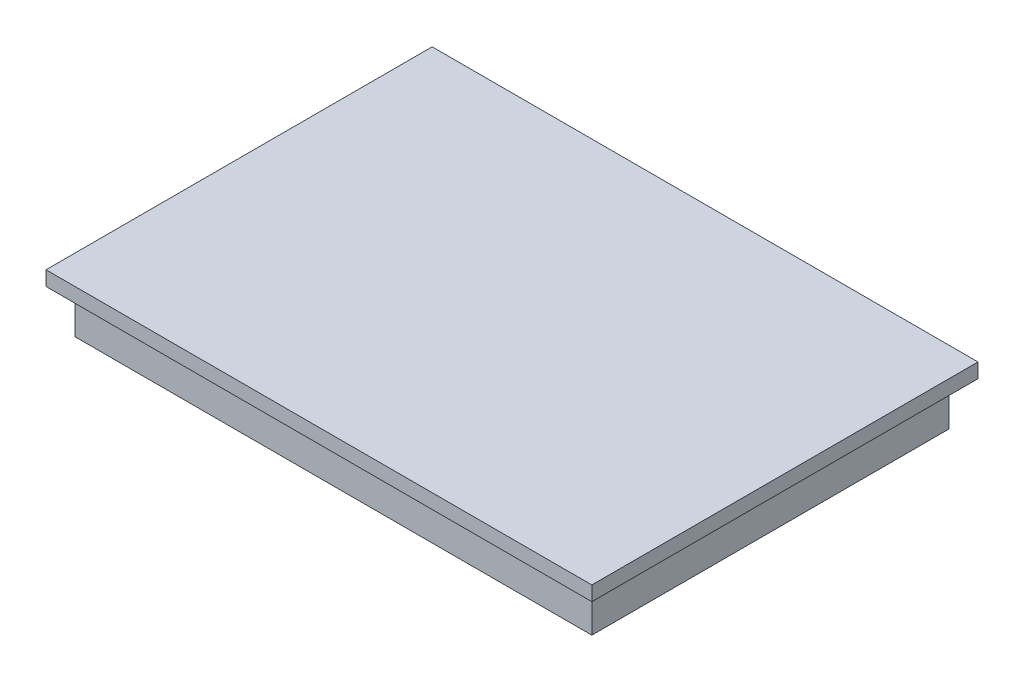
ISO-10303-21;
HEADER;
FILE_DESCRIPTION(('STEP AP214'),'2;1');
FILE_NAME('part.step','',(''),(''),'','','');
FILE_SCHEMA(('AUTOMOTIVE_DESIGN { 1 0 10303 214 1 1 1 1 }'));
ENDSEC;
DATA;
#1=APPLICATION_CONTEXT('core data for automotive mechanical design processes');
#2=APPLICATION_PROTOCOL_DEFINITION('international standard','automotive_design',2000,#1);
#3=PRODUCT_CONTEXT('',#1,'mechanical');
#4=PRODUCT('Part','Part','',(#3));
#5=PRODUCT_RELATED_PRODUCT_CATEGORY('part','',(#4));
#6=PRODUCT_DEFINITION_FORMATION('','',#4);
#7=PRODUCT_DEFINITION_CONTEXT('part definition',#1,'design');
#8=PRODUCT_DEFINITION('design','',#6,#7);
#9=PRODUCT_DEFINITION_SHAPE('','',#8);
#10=(LENGTH_UNIT() NAMED_UNIT(*) SI_UNIT(.MILLI.,.METRE.));
#11=(NAMED_UNIT(*) PLANE_ANGLE_UNIT() SI_UNIT($,.RADIAN.));
#12=(NAMED_UNIT(*) SI_UNIT($,.STERADIAN.) SOLID_ANGLE_UNIT());
#13=UNCERTAINTY_MEASURE_WITH_UNIT(LENGTH_MEASURE(1.E-05),#10,'distance_accuracy_value','');
#14=(GEOMETRIC_REPRESENTATION_CONTEXT(3) GLOBAL_UNCERTAINTY_ASSIGNED_CONTEXT((#13)) GLOBAL_UNIT_ASSIGNED_CONTEXT((#10,
#11,#12)) REPRESENTATION_CONTEXT('',''));
#15=CARTESIAN_POINT('',(0.,0.,0.));
#16=DIRECTION('',(0.,0.,1.));
#17=DIRECTION('',(1.,0.,0.));
#18=AXIS2_PLACEMENT_3D('',#15,#16,#17);
#19=CARTESIAN_POINT('',(0.,20.,0.));
#20=DIRECTION('',(0.,0.,-1.));
#21=DIRECTION('',(-1.,0.,0.));
#22=AXIS2_PLACEMENT_3D('',#19,#20,#21);
#23=PLANE('',#22);
#24=DIRECTION('',(0.,-1.,0.));
#25=VECTOR('',#24,1.);
#26=CARTESIAN_POINT('',(0.,20.,0.));
#27=LINE('',#26,#25);
#28=CARTESIAN_POINT('',(0.,15.,0.));
#29=VERTEX_POINT('',#28);
#30=CARTESIAN_POINT('',(0.,0.,0.));
#31=VERTEX_POINT('',#30);
#32=EDGE_CURVE('E50',#29,#31,#27,.T.);
#33=ORIENTED_EDGE('',*,*,#32,.F.);
#34=DIRECTION('',(1.,0.,0.));
#35=VECTOR('',#34,1.);
#36=CARTESIAN_POINT('',(0.,15.,0.));
#37=LINE('',#36,#35);
#38=CARTESIAN_POINT('',(178.,15.,0.));
#39=VERTEX_POINT('',#38);
#40=EDGE_CURVE('E190',#29,#39,#37,.T.);
#41=ORIENTED_EDGE('',*,*,#40,.T.);
#42=DIRECTION('',(0.,-1.,0.));
#43=VECTOR('',#42,1.);
#44=CARTESIAN_POINT('',(178.,20.,0.));
#45=LINE('',#44,#43);
#46=CARTESIAN_POINT('',(178.,0.,0.));
#47=VERTEX_POINT('',#46);
#48=EDGE_CURVE('E243',#39,#47,#45,.T.);
#49=ORIENTED_EDGE('',*,*,#48,.T.);
#50=DIRECTION('',(1.,0.,0.));
#51=VECTOR('',#50,1.);
#52=CARTESIAN_POINT('',(0.,0.,0.));
#53=LINE('',#52,#51);
#54=EDGE_CURVE('E226',#31,#47,#53,.T.);
#55=ORIENTED_EDGE('',*,*,#54,.F.);
#56=EDGE_LOOP('',(#33,#41,#49,#55));
#57=FACE_BOUND('',#56,.T.);
#58=ADVANCED_FACE('F41',(#57),#23,.T.);
#59=CARTESIAN_POINT('',(0.,20.,0.));
#60=DIRECTION('',(1.,0.,0.));
#61=DIRECTION('',(0.,0.,-1.));
#62=AXIS2_PLACEMENT_3D('',#59,#60,#61);
#63=PLANE('',#62);
#64=DIRECTION('',(0.,0.,1.));
#65=VECTOR('',#64,1.);
#66=CARTESIAN_POINT('',(0.,15.,0.));
#67=LINE('',#66,#65);
#68=CARTESIAN_POINT('',(0.,15.,123.));
#69=VERTEX_POINT('',#68);
#70=EDGE_CURVE('E57',#29,#69,#67,.T.);
#71=ORIENTED_EDGE('',*,*,#70,.F.);
#72=ORIENTED_EDGE('',*,*,#32,.T.);
#73=DIRECTION('',(0.,0.,1.));
#74=VECTOR('',#73,1.);
#75=CARTESIAN_POINT('',(0.,0.,0.));
#76=LINE('',#75,#74);
#77=CARTESIAN_POINT('',(0.,0.,123.));
#78=VERTEX_POINT('',#77);
#79=EDGE_CURVE('E230',#31,#78,#76,.T.);
#80=ORIENTED_EDGE('',*,*,#79,.T.);
#81=DIRECTION('',(0.,-1.,0.));
#82=VECTOR('',#81,1.);
#83=CARTESIAN_POINT('',(0.,20.,123.));
#84=LINE('',#83,#82);
#85=EDGE_CURVE('E250',#69,#78,#84,.T.);
#86=ORIENTED_EDGE('',*,*,#85,.F.);
#87=EDGE_LOOP('',(#71,#72,#80,#86));
#88=FACE_BOUND('',#87,.T.);
#89=ADVANCED_FACE('F298',(#88),#63,.F.);
#90=CARTESIAN_POINT('',(0.,20.,123.));
#91=DIRECTION('',(0.,0.,-1.));
#92=DIRECTION('',(-1.,0.,0.));
#93=AXIS2_PLACEMENT_3D('',#90,#91,#92);
#94=PLANE('',#93);
#95=DIRECTION('',(1.,0.,0.));
#96=VECTOR('',#95,1.);
#97=CARTESIAN_POINT('',(0.,15.,123.));
#98=LINE('',#97,#96);
#99=CARTESIAN_POINT('',(178.,15.,123.));
#100=VERTEX_POINT('',#99);
#101=EDGE_CURVE('E65',#69,#100,#98,.T.);
#102=ORIENTED_EDGE('',*,*,#101,.F.);
#103=ORIENTED_EDGE('',*,*,#85,.T.);
#104=DIRECTION('',(1.,0.,0.));
#105=VECTOR('',#104,1.);
#106=CARTESIAN_POINT('',(0.,0.,123.));
#107=LINE('',#106,#105);
#108=CARTESIAN_POINT('',(178.,0.,123.));
#109=VERTEX_POINT('',#108);
#110=EDGE_CURVE('E234',#78,#109,#107,.T.);
#111=ORIENTED_EDGE('',*,*,#110,.T.);
#112=DIRECTION('',(0.,-1.,0.));
#113=VECTOR('',#112,1.);
#114=CARTESIAN_POINT('',(178.,20.,123.));
#115=LINE('',#114,#113);
#116=EDGE_CURVE('E246',#100,#109,#115,.T.);
#117=ORIENTED_EDGE('',*,*,#116,.F.);
#118=EDGE_LOOP('',(#102,#103,#111,#117));
#119=FACE_BOUND('',#118,.T.);
#120=ADVANCED_FACE('F304',(#119),#94,.F.);
#121=CARTESIAN_POINT('',(4.99999999999998,20.,0.));
#122=DIRECTION('',(-1.,0.,0.));
#123=DIRECTION('',(0.,0.,1.));
#124=AXIS2_PLACEMENT_3D('',#121,#122,#123);
#125=PLANE('',#124);
#126=DIRECTION('',(0.,0.,-1.));
#127=VECTOR('',#126,1.);
#128=CARTESIAN_POINT('',(4.99999999999998,15.,0.));
#129=LINE('',#128,#127);
#130=CARTESIAN_POINT('',(4.99999999999998,15.,118.));
#131=VERTEX_POINT('',#130);
#132=CARTESIAN_POINT('',(4.99999999999998,15.,5.));
#133=VERTEX_POINT('',#132);
#134=EDGE_CURVE('E206',#131,#133,#129,.T.);
#135=ORIENTED_EDGE('',*,*,#134,.F.);
#136=DIRECTION('',(0.,-1.,0.));
#137=VECTOR('',#136,1.);
#138=CARTESIAN_POINT('',(4.99999999999998,20.,118.));
#139=LINE('',#138,#137);
#140=CARTESIAN_POINT('',(4.99999999999998,0.,118.));
#141=VERTEX_POINT('',#140);
#142=EDGE_CURVE('E242',#131,#141,#139,.T.);
#143=ORIENTED_EDGE('',*,*,#142,.T.);
#144=DIRECTION('',(0.,0.,-1.));
#145=VECTOR('',#144,1.);
#146=CARTESIAN_POINT('',(4.99999999999998,0.,0.));
#147=LINE('',#146,#145);
#148=CARTESIAN_POINT('',(4.99999999999998,0.,5.));
#149=VERTEX_POINT('',#148);
#150=EDGE_CURVE('E210',#141,#149,#147,.T.);
#151=ORIENTED_EDGE('',*,*,#150,.T.);
#152=DIRECTION('',(0.,-1.,0.));
#153=VECTOR('',#152,1.);
#154=CARTESIAN_POINT('',(4.99999999999998,20.,5.));
#155=LINE('',#154,#153);
#156=EDGE_CURVE('E247',#133,#149,#155,.T.);
#157=ORIENTED_EDGE('',*,*,#156,.F.);
#158=EDGE_LOOP('',(#135,#143,#151,#157));
#159=FACE_BOUND('',#158,.T.);
#160=ADVANCED_FACE('F43',(#159),#125,.F.);
#161=CARTESIAN_POINT('',(0.,20.,5.));
#162=DIRECTION('',(0.,0.,-1.));
#163=DIRECTION('',(-1.,0.,0.));
#164=AXIS2_PLACEMENT_3D('',#161,#162,#163);
#165=PLANE('',#164);
#166=DIRECTION('',(1.,0.,0.));
#167=VECTOR('',#166,1.);
#168=CARTESIAN_POINT('',(0.,15.,5.));
#169=LINE('',#168,#167);
#170=CARTESIAN_POINT('',(173.,15.,5.));
#171=VERTEX_POINT('',#170);
#172=EDGE_CURVE('E202',#133,#171,#169,.T.);
#173=ORIENTED_EDGE('',*,*,#172,.F.);
#174=ORIENTED_EDGE('',*,*,#156,.T.);
#175=DIRECTION('',(1.,0.,0.));
#176=VECTOR('',#175,1.);
#177=CARTESIAN_POINT('',(0.,0.,5.));
#178=LINE('',#177,#176);
#179=CARTESIAN_POINT('',(173.,0.,5.));
#180=VERTEX_POINT('',#179);
#181=EDGE_CURVE('E214',#149,#180,#178,.T.);
#182=ORIENTED_EDGE('',*,*,#181,.T.);
#183=DIRECTION('',(0.,-1.,0.));
#184=VECTOR('',#183,1.);
#185=CARTESIAN_POINT('',(173.,20.,5.));
#186=LINE('',#185,#184);
#187=EDGE_CURVE('E260',#171,#180,#186,.T.);
#188=ORIENTED_EDGE('',*,*,#187,.F.);
#189=EDGE_LOOP('',(#173,#174,#182,#188));
#190=FACE_BOUND('',#189,.T.);
#191=ADVANCED_FACE('F266',(#190),#165,.F.);
#192=CARTESIAN_POINT('',(173.,20.,0.));
#193=DIRECTION('',(1.,0.,0.));
#194=DIRECTION('',(0.,0.,-1.));
#195=AXIS2_PLACEMENT_3D('',#192,#193,#194);
#196=PLANE('',#195);
#197=DIRECTION('',(0.,0.,1.));
#198=VECTOR('',#197,1.);
#199=CARTESIAN_POINT('',(173.,15.,0.));
#200=LINE('',#199,#198);
#201=CARTESIAN_POINT('',(173.,15.,118.));
#202=VERTEX_POINT('',#201);
#203=EDGE_CURVE('E198',#171,#202,#200,.T.);
#204=ORIENTED_EDGE('',*,*,#203,.F.);
#205=ORIENTED_EDGE('',*,*,#187,.T.);
#206=DIRECTION('',(0.,0.,1.));
#207=VECTOR('',#206,1.);
#208=CARTESIAN_POINT('',(173.,0.,0.));
#209=LINE('',#208,#207);
#210=CARTESIAN_POINT('',(173.,0.,118.));
#211=VERTEX_POINT('',#210);
#212=EDGE_CURVE('E218',#180,#211,#209,.T.);
#213=ORIENTED_EDGE('',*,*,#212,.T.);
#214=DIRECTION('',(0.,-1.,0.));
#215=VECTOR('',#214,1.);
#216=CARTESIAN_POINT('',(173.,20.,118.));
#217=LINE('',#216,#215);
#218=EDGE_CURVE('E257',#202,#211,#217,.T.);
#219=ORIENTED_EDGE('',*,*,#218,.F.);
#220=EDGE_LOOP('',(#204,#205,#213,#219));
#221=FACE_BOUND('',#220,.T.);
#222=ADVANCED_FACE('F280',(#221),#196,.F.);
#223=CARTESIAN_POINT('',(0.,20.,118.));
#224=DIRECTION('',(0.,0.,1.));
#225=DIRECTION('',(1.,0.,0.));
#226=AXIS2_PLACEMENT_3D('',#223,#224,#225);
#227=PLANE('',#226);
#228=DIRECTION('',(-1.,0.,0.));
#229=VECTOR('',#228,1.);
#230=CARTESIAN_POINT('',(0.,15.,118.));
#231=LINE('',#230,#229);
#232=EDGE_CURVE('E194',#202,#131,#231,.T.);
#233=ORIENTED_EDGE('',*,*,#232,.F.);
#234=ORIENTED_EDGE('',*,*,#218,.T.);
#235=DIRECTION('',(-1.,0.,0.));
#236=VECTOR('',#235,1.);
#237=CARTESIAN_POINT('',(0.,0.,118.));
#238=LINE('',#237,#236);
#239=EDGE_CURVE('E222',#211,#141,#238,.T.);
#240=ORIENTED_EDGE('',*,*,#239,.T.);
#241=ORIENTED_EDGE('',*,*,#142,.F.);
#242=EDGE_LOOP('',(#233,#234,#240,#241));
#243=FACE_BOUND('',#242,.T.);
#244=ADVANCED_FACE('F277',(#243),#227,.F.);
#245=CARTESIAN_POINT('',(178.,20.,0.));
#246=DIRECTION('',(-1.,0.,0.));
#247=DIRECTION('',(0.,0.,1.));
#248=AXIS2_PLACEMENT_3D('',#245,#246,#247);
#249=PLANE('',#248);
#250=DIRECTION('',(0.,0.,-1.));
#251=VECTOR('',#250,1.);
#252=CARTESIAN_POINT('',(178.,15.,0.));
#253=LINE('',#252,#251);
#254=EDGE_CURVE('E11',#100,#39,#253,.T.);
#255=ORIENTED_EDGE('',*,*,#254,.F.);
#256=ORIENTED_EDGE('',*,*,#116,.T.);
#257=DIRECTION('',(0.,0.,-1.));
#258=VECTOR('',#257,1.);
#259=CARTESIAN_POINT('',(178.,0.,0.));
#260=LINE('',#259,#258);
#261=EDGE_CURVE('E238',#109,#47,#260,.T.);
#262=ORIENTED_EDGE('',*,*,#261,.T.);
#263=ORIENTED_EDGE('',*,*,#48,.F.);
#264=EDGE_LOOP('',(#255,#256,#262,#263));
#265=FACE_BOUND('',#264,.T.);
#266=ADVANCED_FACE('F310',(#265),#249,.F.);
#267=CARTESIAN_POINT('',(0.,0.,0.));
#268=DIRECTION('',(0.,1.,0.));
#269=DIRECTION('',(0.,0.,1.));
#270=AXIS2_PLACEMENT_3D('',#267,#268,#269);
#271=PLANE('',#270);
#272=ORIENTED_EDGE('',*,*,#150,.F.);
#273=ORIENTED_EDGE('',*,*,#239,.F.);
#274=ORIENTED_EDGE('',*,*,#212,.F.);
#275=ORIENTED_EDGE('',*,*,#181,.F.);
#276=EDGE_LOOP('',(#272,#273,#274,#275));
#277=FACE_BOUND('',#276,.T.);
#278=ORIENTED_EDGE('',*,*,#54,.T.);
#279=ORIENTED_EDGE('',*,*,#261,.F.);
#280=ORIENTED_EDGE('',*,*,#110,.F.);
#281=ORIENTED_EDGE('',*,*,#79,.F.);
#282=EDGE_LOOP('',(#278,#279,#280,#281));
#283=FACE_BOUND('',#282,.T.);
#284=ADVANCED_FACE('F273',(#277,#283),#271,.F.);
#285=CARTESIAN_POINT('',(0.,15.,0.));
#286=DIRECTION('',(0.,1.,0.));
#287=DIRECTION('',(0.,0.,1.));
#288=AXIS2_PLACEMENT_3D('',#285,#286,#287);
#289=PLANE('',#288);
#290=ORIENTED_EDGE('',*,*,#40,.F.);
#291=ORIENTED_EDGE('',*,*,#70,.T.);
#292=ORIENTED_EDGE('',*,*,#101,.T.);
#293=ORIENTED_EDGE('',*,*,#254,.T.);
#294=EDGE_LOOP('',(#290,#291,#292,#293));
#295=FACE_BOUND('',#294,.T.);
#296=DIRECTION('',(1.,0.,0.));
#297=VECTOR('',#296,1.);
#298=CARTESIAN_POINT('',(0.,15.,-5.));
#299=LINE('',#298,#297);
#300=CARTESIAN_POINT('',(-4.99999999999998,15.,-5.));
#301=VERTEX_POINT('',#300);
#302=CARTESIAN_POINT('',(183.,15.,-5.));
#303=VERTEX_POINT('',#302);
#304=EDGE_CURVE('E136',#301,#303,#299,.T.);
#305=ORIENTED_EDGE('',*,*,#304,.T.);
#306=DIRECTION('',(0.,0.,1.));
#307=VECTOR('',#306,1.);
#308=CARTESIAN_POINT('',(183.,15.,0.));
#309=LINE('',#308,#307);
#310=CARTESIAN_POINT('',(183.,15.,128.));
#311=VERTEX_POINT('',#310);
#312=EDGE_CURVE('E155',#303,#311,#309,.T.);
#313=ORIENTED_EDGE('',*,*,#312,.T.);
#314=DIRECTION('',(-1.,0.,0.));
#315=VECTOR('',#314,1.);
#316=CARTESIAN_POINT('',(0.,15.,128.));
#317=LINE('',#316,#315);
#318=CARTESIAN_POINT('',(-4.99999999999998,15.,128.));
#319=VERTEX_POINT('',#318);
#320=EDGE_CURVE('E139',#311,#319,#317,.T.);
#321=ORIENTED_EDGE('',*,*,#320,.T.);
#322=DIRECTION('',(0.,0.,-1.));
#323=VECTOR('',#322,1.);
#324=CARTESIAN_POINT('',(-4.99999999999999,15.,0.));
#325=LINE('',#324,#323);
#326=EDGE_CURVE('E132',#319,#301,#325,.T.);
#327=ORIENTED_EDGE('',*,*,#326,.T.);
#328=EDGE_LOOP('',(#305,#313,#321,#327));
#329=FACE_BOUND('',#328,.T.);
#330=ADVANCED_FACE('F134',(#295,#329),#289,.F.);
#331=CARTESIAN_POINT('',(-4.99999999999999,15.,0.));
#332=DIRECTION('',(1.,0.,0.));
#333=DIRECTION('',(0.,0.,-1.));
#334=AXIS2_PLACEMENT_3D('',#331,#332,#333);
#335=PLANE('',#334);
#336=DIRECTION('',(0.,0.,-1.));
#337=VECTOR('',#336,1.);
#338=CARTESIAN_POINT('',(-4.99999999999999,20.,0.));
#339=LINE('',#338,#337);
#340=CARTESIAN_POINT('',(-4.99999999999998,20.,128.));
#341=VERTEX_POINT('',#340);
#342=CARTESIAN_POINT('',(-4.99999999999998,20.,-5.));
#343=VERTEX_POINT('',#342);
#344=EDGE_CURVE('E149',#341,#343,#339,.T.);
#345=ORIENTED_EDGE('',*,*,#344,.T.);
#346=DIRECTION('',(0.,1.,0.));
#347=VECTOR('',#346,1.);
#348=CARTESIAN_POINT('',(-4.99999999999998,15.,-5.));
#349=LINE('',#348,#347);
#350=EDGE_CURVE('E146',#301,#343,#349,.T.);
#351=ORIENTED_EDGE('',*,*,#350,.F.);
#352=ORIENTED_EDGE('',*,*,#326,.F.);
#353=DIRECTION('',(0.,1.,0.));
#354=VECTOR('',#353,1.);
#355=CARTESIAN_POINT('',(-4.99999999999998,15.,128.));
#356=LINE('',#355,#354);
#357=EDGE_CURVE('E154',#319,#341,#356,.T.);
#358=ORIENTED_EDGE('',*,*,#357,.T.);
#359=EDGE_LOOP('',(#345,#351,#352,#358));
#360=FACE_BOUND('',#359,.T.);
#361=ADVANCED_FACE('F147',(#360),#335,.F.);
#362=CARTESIAN_POINT('',(0.,15.,128.));
#363=DIRECTION('',(0.,0.,-1.));
#364=DIRECTION('',(-1.,0.,0.));
#365=AXIS2_PLACEMENT_3D('',#362,#363,#364);
#366=PLANE('',#365);
#367=DIRECTION('',(-1.,0.,0.));
#368=VECTOR('',#367,1.);
#369=CARTESIAN_POINT('',(0.,20.,128.));
#370=LINE('',#369,#368);
#371=CARTESIAN_POINT('',(183.,20.,128.));
#372=VERTEX_POINT('',#371);
#373=EDGE_CURVE('E164',#372,#341,#370,.T.);
#374=ORIENTED_EDGE('',*,*,#373,.T.);
#375=ORIENTED_EDGE('',*,*,#357,.F.);
#376=ORIENTED_EDGE('',*,*,#320,.F.);
#377=DIRECTION('',(0.,1.,0.));
#378=VECTOR('',#377,1.);
#379=CARTESIAN_POINT('',(183.,15.,128.));
#380=LINE('',#379,#378);
#381=EDGE_CURVE('E180',#311,#372,#380,.T.);
#382=ORIENTED_EDGE('',*,*,#381,.T.);
#383=EDGE_LOOP('',(#374,#375,#376,#382));
#384=FACE_BOUND('',#383,.T.);
#385=ADVANCED_FACE('F329',(#384),#366,.F.);
#386=CARTESIAN_POINT('',(183.,15.,0.));
#387=DIRECTION('',(-1.,0.,0.));
#388=DIRECTION('',(0.,0.,1.));
#389=AXIS2_PLACEMENT_3D('',#386,#387,#388);
#390=PLANE('',#389);
#391=DIRECTION('',(0.,0.,1.));
#392=VECTOR('',#391,1.);
#393=CARTESIAN_POINT('',(183.,20.,0.));
#394=LINE('',#393,#392);
#395=CARTESIAN_POINT('',(183.,20.,-5.));
#396=VERTEX_POINT('',#395);
#397=EDGE_CURVE('E161',#396,#372,#394,.T.);
#398=ORIENTED_EDGE('',*,*,#397,.T.);
#399=ORIENTED_EDGE('',*,*,#381,.F.);
#400=ORIENTED_EDGE('',*,*,#312,.F.);
#401=DIRECTION('',(0.,1.,0.));
#402=VECTOR('',#401,1.);
#403=CARTESIAN_POINT('',(183.,15.,-5.));
#404=LINE('',#403,#402);
#405=EDGE_CURVE('E159',#303,#396,#404,.T.);
#406=ORIENTED_EDGE('',*,*,#405,.T.);
#407=EDGE_LOOP('',(#398,#399,#400,#406));
#408=FACE_BOUND('',#407,.T.);
#409=ADVANCED_FACE('F292',(#408),#390,.F.);
#410=CARTESIAN_POINT('',(0.,15.,-5.));
#411=DIRECTION('',(0.,0.,1.));
#412=DIRECTION('',(1.,0.,0.));
#413=AXIS2_PLACEMENT_3D('',#410,#411,#412);
#414=PLANE('',#413);
#415=DIRECTION('',(1.,0.,0.));
#416=VECTOR('',#415,1.);
#417=CARTESIAN_POINT('',(0.,20.,-5.));
#418=LINE('',#417,#416);
#419=EDGE_CURVE('E171',#343,#396,#418,.T.);
#420=ORIENTED_EDGE('',*,*,#419,.T.);
#421=ORIENTED_EDGE('',*,*,#405,.F.);
#422=ORIENTED_EDGE('',*,*,#304,.F.);
#423=ORIENTED_EDGE('',*,*,#350,.T.);
#424=EDGE_LOOP('',(#420,#421,#422,#423));
#425=FACE_BOUND('',#424,.T.);
#426=ADVANCED_FACE('F157',(#425),#414,.F.);
#427=ORIENTED_EDGE('',*,*,#232,.T.);
#428=ORIENTED_EDGE('',*,*,#134,.T.);
#429=ORIENTED_EDGE('',*,*,#172,.T.);
#430=ORIENTED_EDGE('',*,*,#203,.T.);
#431=EDGE_LOOP('',(#427,#428,#429,#430));
#432=FACE_BOUND('',#431,.T.);
#433=ADVANCED_FACE('F282',(#432),#289,.F.);
#434=CARTESIAN_POINT('',(0.,20.,0.));
#435=DIRECTION('',(0.,1.,0.));
#436=DIRECTION('',(0.,0.,1.));
#437=AXIS2_PLACEMENT_3D('',#434,#435,#436);
#438=PLANE('',#437);
#439=ORIENTED_EDGE('',*,*,#419,.F.);
#440=ORIENTED_EDGE('',*,*,#344,.F.);
#441=ORIENTED_EDGE('',*,*,#373,.F.);
#442=ORIENTED_EDGE('',*,*,#397,.F.);
#443=EDGE_LOOP('',(#439,#440,#441,#442));
#444=FACE_BOUND('',#443,.T.);
#445=ADVANCED_FACE('F284',(#444),#438,.T.);
#446=CLOSED_SHELL('',(#58,#89,#120,#160,#191,#222,#244,#266,#284,#330,#361,#385,#409,#426,#433,#445));
#447=MANIFOLD_SOLID_BREP('B2',#446);
#448=ADVANCED_BREP_SHAPE_REPRESENTATION('',(#18,#447),#14);
#449=SHAPE_DEFINITION_REPRESENTATION(#9,#448);
ENDSEC;
END-ISO-10303-21;
